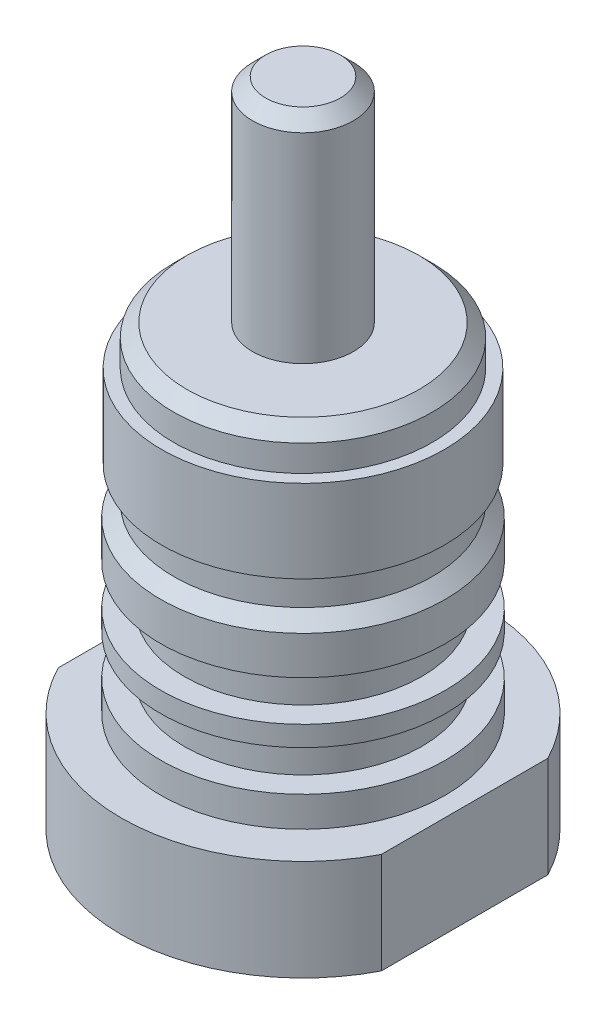
ISO-10303-21;
HEADER;
FILE_DESCRIPTION(('STEP AP214'),'2;1');
FILE_NAME('part.step','',(''),(''),'','','');
FILE_SCHEMA(('AUTOMOTIVE_DESIGN { 1 0 10303 214 1 1 1 1 }'));
ENDSEC;
DATA;
#1=APPLICATION_CONTEXT('core data for automotive mechanical design processes');
#2=APPLICATION_PROTOCOL_DEFINITION('international standard','automotive_design',2000,#1);
#3=PRODUCT_CONTEXT('',#1,'mechanical');
#4=PRODUCT('Part','Part','',(#3));
#5=PRODUCT_RELATED_PRODUCT_CATEGORY('part','',(#4));
#6=PRODUCT_DEFINITION_FORMATION('','',#4);
#7=PRODUCT_DEFINITION_CONTEXT('part definition',#1,'design');
#8=PRODUCT_DEFINITION('design','',#6,#7);
#9=PRODUCT_DEFINITION_SHAPE('','',#8);
#10=(LENGTH_UNIT() NAMED_UNIT(*) SI_UNIT(.MILLI.,.METRE.));
#11=(NAMED_UNIT(*) PLANE_ANGLE_UNIT() SI_UNIT($,.RADIAN.));
#12=(NAMED_UNIT(*) SI_UNIT($,.STERADIAN.) SOLID_ANGLE_UNIT());
#13=UNCERTAINTY_MEASURE_WITH_UNIT(LENGTH_MEASURE(1.E-05),#10,'distance_accuracy_value','');
#14=(GEOMETRIC_REPRESENTATION_CONTEXT(3) GLOBAL_UNCERTAINTY_ASSIGNED_CONTEXT((#13)) GLOBAL_UNIT_ASSIGNED_CONTEXT((#10,
#11,#12)) REPRESENTATION_CONTEXT('',''));
#15=CARTESIAN_POINT('',(0.,0.,0.));
#16=DIRECTION('',(0.,0.,1.));
#17=DIRECTION('',(1.,0.,0.));
#18=AXIS2_PLACEMENT_3D('',#15,#16,#17);
#19=CARTESIAN_POINT('',(0.,0.,0.));
#20=DIRECTION('',(0.,1.,0.));
#21=DIRECTION('',(-1.,0.,0.));
#22=AXIS2_PLACEMENT_3D('',#19,#20,#21);
#23=CYLINDRICAL_SURFACE('',#22,9.);
#24=DIRECTION('',(0.,-1.,0.));
#25=VECTOR('',#24,1.);
#26=CARTESIAN_POINT('',(8.,10.55,4.12310562561766));
#27=LINE('',#26,#25);
#28=CARTESIAN_POINT('',(8.00000000000001,-16.75,4.12310562561766));
#29=VERTEX_POINT('',#28);
#30=CARTESIAN_POINT('',(8.00000000000001,-21.75,4.12310562561766));
#31=VERTEX_POINT('',#30);
#32=EDGE_CURVE('E79',#29,#31,#27,.T.);
#33=ORIENTED_EDGE('',*,*,#32,.F.);
#34=CARTESIAN_POINT('',(0.,-16.75,0.));
#35=DIRECTION('',(0.,1.,0.));
#36=DIRECTION('',(-1.,0.,0.));
#37=AXIS2_PLACEMENT_3D('',#34,#35,#36);
#38=CIRCLE('',#37,9.);
#39=CARTESIAN_POINT('',(-8.,-16.75,4.12310562561765));
#40=VERTEX_POINT('',#39);
#41=EDGE_CURVE('E102',#40,#29,#38,.T.);
#42=ORIENTED_EDGE('',*,*,#41,.F.);
#43=DIRECTION('',(0.,-1.,0.));
#44=VECTOR('',#43,1.);
#45=CARTESIAN_POINT('',(-8.,10.55,4.12310562561766));
#46=LINE('',#45,#44);
#47=CARTESIAN_POINT('',(-8.,-21.75,4.12310562561766));
#48=VERTEX_POINT('',#47);
#49=EDGE_CURVE('E63',#40,#48,#46,.T.);
#50=ORIENTED_EDGE('',*,*,#49,.T.);
#51=CARTESIAN_POINT('',(0.,-21.75,0.));
#52=DIRECTION('',(0.,1.,0.));
#53=DIRECTION('',(-1.,0.,0.));
#54=AXIS2_PLACEMENT_3D('',#51,#52,#53);
#55=CIRCLE('',#54,9.);
#56=EDGE_CURVE('E94',#48,#31,#55,.T.);
#57=ORIENTED_EDGE('',*,*,#56,.T.);
#58=EDGE_LOOP('',(#33,#42,#50,#57));
#59=FACE_BOUND('',#58,.T.);
#60=ADVANCED_FACE('F39',(#59),#23,.T.);
#61=CARTESIAN_POINT('',(0.,-21.75,0.));
#62=DIRECTION('',(0.,-1.,0.));
#63=DIRECTION('',(1.,0.,0.));
#64=AXIS2_PLACEMENT_3D('',#61,#62,#63);
#65=PLANE('',#64);
#66=DIRECTION('',(0.,0.,-1.));
#67=VECTOR('',#66,1.);
#68=CARTESIAN_POINT('',(8.00000000000001,-21.75,4.12310562561766));
#69=LINE('',#68,#67);
#70=CARTESIAN_POINT('',(8.00000000000001,-21.75,-4.12310562561766));
#71=VERTEX_POINT('',#70);
#72=EDGE_CURVE('E82',#31,#71,#69,.T.);
#73=ORIENTED_EDGE('',*,*,#72,.F.);
#74=ORIENTED_EDGE('',*,*,#56,.F.);
#75=DIRECTION('',(0.,0.,1.));
#76=VECTOR('',#75,1.);
#77=CARTESIAN_POINT('',(-8.,-21.75,4.12310562561766));
#78=LINE('',#77,#76);
#79=CARTESIAN_POINT('',(-8.,-21.75,-4.12310562561766));
#80=VERTEX_POINT('',#79);
#81=EDGE_CURVE('E97',#80,#48,#78,.T.);
#82=ORIENTED_EDGE('',*,*,#81,.F.);
#83=EDGE_CURVE('E96',#71,#80,#55,.T.);
#84=ORIENTED_EDGE('',*,*,#83,.F.);
#85=EDGE_LOOP('',(#73,#74,#82,#84));
#86=FACE_BOUND('',#85,.T.);
#87=ADVANCED_FACE('F92',(#86),#65,.T.);
#88=DIRECTION('',(0.,-1.,0.));
#89=VECTOR('',#88,1.);
#90=CARTESIAN_POINT('',(8.,10.55,-4.12310562561766));
#91=LINE('',#90,#89);
#92=CARTESIAN_POINT('',(8.,-16.75,-4.12310562561765));
#93=VERTEX_POINT('',#92);
#94=EDGE_CURVE('E55',#93,#71,#91,.T.);
#95=ORIENTED_EDGE('',*,*,#94,.T.);
#96=ORIENTED_EDGE('',*,*,#83,.T.);
#97=DIRECTION('',(0.,-1.,0.));
#98=VECTOR('',#97,1.);
#99=CARTESIAN_POINT('',(-8.,10.55,-4.12310562561766));
#100=LINE('',#99,#98);
#101=CARTESIAN_POINT('',(-8.,-16.75,-4.12310562561766));
#102=VERTEX_POINT('',#101);
#103=EDGE_CURVE('E155',#102,#80,#100,.T.);
#104=ORIENTED_EDGE('',*,*,#103,.F.);
#105=EDGE_CURVE('E148',#93,#102,#38,.T.);
#106=ORIENTED_EDGE('',*,*,#105,.F.);
#107=EDGE_LOOP('',(#95,#96,#104,#106));
#108=FACE_BOUND('',#107,.T.);
#109=ADVANCED_FACE('F131',(#108),#23,.T.);
#110=CARTESIAN_POINT('',(-8.99999999999999,-16.75,0.));
#111=DIRECTION('',(0.,1.,0.));
#112=DIRECTION('',(-1.,0.,0.));
#113=AXIS2_PLACEMENT_3D('',#110,#111,#112);
#114=PLANE('',#113);
#115=DIRECTION('',(0.,0.,1.));
#116=VECTOR('',#115,1.);
#117=CARTESIAN_POINT('',(8.,-16.75,0.));
#118=LINE('',#117,#116);
#119=EDGE_CURVE('E83',#93,#29,#118,.T.);
#120=ORIENTED_EDGE('',*,*,#119,.F.);
#121=ORIENTED_EDGE('',*,*,#105,.T.);
#122=DIRECTION('',(0.,0.,-1.));
#123=VECTOR('',#122,1.);
#124=CARTESIAN_POINT('',(-8.,-16.75,0.));
#125=LINE('',#124,#123);
#126=EDGE_CURVE('E99',#40,#102,#125,.T.);
#127=ORIENTED_EDGE('',*,*,#126,.F.);
#128=ORIENTED_EDGE('',*,*,#41,.T.);
#129=EDGE_LOOP('',(#120,#121,#127,#128));
#130=FACE_BOUND('',#129,.T.);
#131=CARTESIAN_POINT('',(0.,-16.75,0.));
#132=DIRECTION('',(0.,1.,0.));
#133=DIRECTION('',(-1.,0.,0.));
#134=AXIS2_PLACEMENT_3D('',#131,#132,#133);
#135=CIRCLE('',#134,7.05);
#136=CARTESIAN_POINT('',(-7.05,-16.75,0.));
#137=VERTEX_POINT('',#136);
#138=EDGE_CURVE('E196',#137,#137,#135,.T.);
#139=ORIENTED_EDGE('',*,*,#138,.F.);
#140=EDGE_LOOP('',(#139));
#141=FACE_BOUND('',#140,.T.);
#142=ADVANCED_FACE('F138',(#130,#141),#114,.T.);
#143=CARTESIAN_POINT('',(0.,0.,0.));
#144=DIRECTION('',(0.,1.,0.));
#145=DIRECTION('',(-1.,0.,0.));
#146=AXIS2_PLACEMENT_3D('',#143,#144,#145);
#147=CYLINDRICAL_SURFACE('',#146,7.05);
#148=ORIENTED_EDGE('',*,*,#138,.T.);
#149=EDGE_LOOP('',(#148));
#150=FACE_BOUND('',#149,.T.);
#151=CARTESIAN_POINT('',(0.,-15.25,0.));
#152=DIRECTION('',(0.,1.,0.));
#153=DIRECTION('',(-1.,0.,0.));
#154=AXIS2_PLACEMENT_3D('',#151,#152,#153);
#155=CIRCLE('',#154,7.05);
#156=CARTESIAN_POINT('',(-7.05,-15.25,0.));
#157=VERTEX_POINT('',#156);
#158=EDGE_CURVE('E194',#157,#157,#155,.T.);
#159=ORIENTED_EDGE('',*,*,#158,.F.);
#160=EDGE_LOOP('',(#159));
#161=FACE_BOUND('',#160,.T.);
#162=ADVANCED_FACE('F143',(#150,#161),#147,.T.);
#163=CARTESIAN_POINT('',(-7.05,-15.25,0.));
#164=DIRECTION('',(0.,1.,0.));
#165=DIRECTION('',(-1.,0.,0.));
#166=AXIS2_PLACEMENT_3D('',#163,#164,#165);
#167=PLANE('',#166);
#168=ORIENTED_EDGE('',*,*,#158,.T.);
#169=EDGE_LOOP('',(#168));
#170=FACE_BOUND('',#169,.T.);
#171=CARTESIAN_POINT('',(0.,-15.25,0.));
#172=DIRECTION('',(0.,1.,0.));
#173=DIRECTION('',(-1.,0.,0.));
#174=AXIS2_PLACEMENT_3D('',#171,#172,#173);
#175=CIRCLE('',#174,5.875);
#176=CARTESIAN_POINT('',(-5.875,-15.25,0.));
#177=VERTEX_POINT('',#176);
#178=EDGE_CURVE('E191',#177,#177,#175,.T.);
#179=ORIENTED_EDGE('',*,*,#178,.F.);
#180=EDGE_LOOP('',(#179));
#181=FACE_BOUND('',#180,.T.);
#182=ADVANCED_FACE('F266',(#170,#181),#167,.T.);
#183=CARTESIAN_POINT('',(0.,0.,0.));
#184=DIRECTION('',(0.,1.,0.));
#185=DIRECTION('',(-1.,0.,0.));
#186=AXIS2_PLACEMENT_3D('',#183,#184,#185);
#187=CYLINDRICAL_SURFACE('',#186,5.875);
#188=ORIENTED_EDGE('',*,*,#178,.T.);
#189=EDGE_LOOP('',(#188));
#190=FACE_BOUND('',#189,.T.);
#191=CARTESIAN_POINT('',(0.,-13.25,0.));
#192=DIRECTION('',(0.,1.,0.));
#193=DIRECTION('',(-1.,0.,0.));
#194=AXIS2_PLACEMENT_3D('',#191,#192,#193);
#195=CIRCLE('',#194,5.875);
#196=CARTESIAN_POINT('',(-5.875,-13.25,0.));
#197=VERTEX_POINT('',#196);
#198=EDGE_CURVE('E188',#197,#197,#195,.T.);
#199=ORIENTED_EDGE('',*,*,#198,.F.);
#200=EDGE_LOOP('',(#199));
#201=FACE_BOUND('',#200,.T.);
#202=ADVANCED_FACE('F262',(#190,#201),#187,.T.);
#203=CARTESIAN_POINT('',(-5.875,-13.25,0.));
#204=DIRECTION('',(0.,-1.,0.));
#205=DIRECTION('',(1.,0.,0.));
#206=AXIS2_PLACEMENT_3D('',#203,#204,#205);
#207=PLANE('',#206);
#208=ORIENTED_EDGE('',*,*,#198,.T.);
#209=EDGE_LOOP('',(#208));
#210=FACE_BOUND('',#209,.T.);
#211=CARTESIAN_POINT('',(0.,-13.25,0.));
#212=DIRECTION('',(0.,1.,0.));
#213=DIRECTION('',(-1.,0.,0.));
#214=AXIS2_PLACEMENT_3D('',#211,#212,#213);
#215=CIRCLE('',#214,7.05);
#216=CARTESIAN_POINT('',(-7.05,-13.25,0.));
#217=VERTEX_POINT('',#216);
#218=EDGE_CURVE('E185',#217,#217,#215,.T.);
#219=ORIENTED_EDGE('',*,*,#218,.F.);
#220=EDGE_LOOP('',(#219));
#221=FACE_BOUND('',#220,.T.);
#222=ADVANCED_FACE('F258',(#210,#221),#207,.T.);
#223=CARTESIAN_POINT('',(0.,0.,0.));
#224=DIRECTION('',(0.,1.,0.));
#225=DIRECTION('',(-1.,0.,0.));
#226=AXIS2_PLACEMENT_3D('',#223,#224,#225);
#227=CYLINDRICAL_SURFACE('',#226,7.05);
#228=ORIENTED_EDGE('',*,*,#218,.T.);
#229=EDGE_LOOP('',(#228));
#230=FACE_BOUND('',#229,.T.);
#231=CARTESIAN_POINT('',(0.,-12.25,0.));
#232=DIRECTION('',(0.,1.,0.));
#233=DIRECTION('',(-1.,0.,0.));
#234=AXIS2_PLACEMENT_3D('',#231,#232,#233);
#235=CIRCLE('',#234,7.05);
#236=CARTESIAN_POINT('',(-7.05,-12.25,0.));
#237=VERTEX_POINT('',#236);
#238=EDGE_CURVE('E182',#237,#237,#235,.T.);
#239=ORIENTED_EDGE('',*,*,#238,.F.);
#240=EDGE_LOOP('',(#239));
#241=FACE_BOUND('',#240,.T.);
#242=ADVANCED_FACE('F254',(#230,#241),#227,.T.);
#243=CARTESIAN_POINT('',(-7.05,-12.25,0.));
#244=DIRECTION('',(0.,1.,0.));
#245=DIRECTION('',(-1.,0.,0.));
#246=AXIS2_PLACEMENT_3D('',#243,#244,#245);
#247=PLANE('',#246);
#248=ORIENTED_EDGE('',*,*,#238,.T.);
#249=EDGE_LOOP('',(#248));
#250=FACE_BOUND('',#249,.T.);
#251=CARTESIAN_POINT('',(0.,-12.25,0.));
#252=DIRECTION('',(0.,1.,0.));
#253=DIRECTION('',(-1.,0.,0.));
#254=AXIS2_PLACEMENT_3D('',#251,#252,#253);
#255=CIRCLE('',#254,5.875);
#256=CARTESIAN_POINT('',(-5.875,-12.25,0.));
#257=VERTEX_POINT('',#256);
#258=EDGE_CURVE('E179',#257,#257,#255,.T.);
#259=ORIENTED_EDGE('',*,*,#258,.F.);
#260=EDGE_LOOP('',(#259));
#261=FACE_BOUND('',#260,.T.);
#262=ADVANCED_FACE('F250',(#250,#261),#247,.T.);
#263=CARTESIAN_POINT('',(0.,0.,0.));
#264=DIRECTION('',(0.,1.,0.));
#265=DIRECTION('',(-1.,0.,0.));
#266=AXIS2_PLACEMENT_3D('',#263,#264,#265);
#267=CYLINDRICAL_SURFACE('',#266,5.875);
#268=ORIENTED_EDGE('',*,*,#258,.T.);
#269=EDGE_LOOP('',(#268));
#270=FACE_BOUND('',#269,.T.);
#271=CARTESIAN_POINT('',(0.,-10.25,0.));
#272=DIRECTION('',(0.,1.,0.));
#273=DIRECTION('',(-1.,0.,0.));
#274=AXIS2_PLACEMENT_3D('',#271,#272,#273);
#275=CIRCLE('',#274,5.875);
#276=CARTESIAN_POINT('',(-5.875,-10.25,0.));
#277=VERTEX_POINT('',#276);
#278=EDGE_CURVE('E176',#277,#277,#275,.T.);
#279=ORIENTED_EDGE('',*,*,#278,.F.);
#280=EDGE_LOOP('',(#279));
#281=FACE_BOUND('',#280,.T.);
#282=ADVANCED_FACE('F246',(#270,#281),#267,.T.);
#283=CARTESIAN_POINT('',(-5.875,-10.25,0.));
#284=DIRECTION('',(0.,-1.,0.));
#285=DIRECTION('',(1.,0.,0.));
#286=AXIS2_PLACEMENT_3D('',#283,#284,#285);
#287=PLANE('',#286);
#288=ORIENTED_EDGE('',*,*,#278,.T.);
#289=EDGE_LOOP('',(#288));
#290=FACE_BOUND('',#289,.T.);
#291=CARTESIAN_POINT('',(0.,-10.25,0.));
#292=DIRECTION('',(0.,1.,0.));
#293=DIRECTION('',(-1.,0.,0.));
#294=AXIS2_PLACEMENT_3D('',#291,#292,#293);
#295=CIRCLE('',#294,7.05);
#296=CARTESIAN_POINT('',(-7.05,-10.25,0.));
#297=VERTEX_POINT('',#296);
#298=EDGE_CURVE('E173',#297,#297,#295,.T.);
#299=ORIENTED_EDGE('',*,*,#298,.F.);
#300=EDGE_LOOP('',(#299));
#301=FACE_BOUND('',#300,.T.);
#302=ADVANCED_FACE('F242',(#290,#301),#287,.T.);
#303=CARTESIAN_POINT('',(0.,0.,0.));
#304=DIRECTION('',(0.,1.,0.));
#305=DIRECTION('',(-1.,0.,0.));
#306=AXIS2_PLACEMENT_3D('',#303,#304,#305);
#307=CYLINDRICAL_SURFACE('',#306,7.05);
#308=CARTESIAN_POINT('',(0.,-8.35,0.));
#309=DIRECTION('',(0.,1.,0.));
#310=DIRECTION('',(-1.,0.,0.));
#311=AXIS2_PLACEMENT_3D('',#308,#309,#310);
#312=CIRCLE('',#311,7.05);
#313=CARTESIAN_POINT('',(-7.05,-8.35,0.));
#314=VERTEX_POINT('',#313);
#315=EDGE_CURVE('E107',#314,#314,#312,.F.);
#316=ORIENTED_EDGE('',*,*,#315,.T.);
#317=EDGE_LOOP('',(#316));
#318=FACE_BOUND('',#317,.T.);
#319=ORIENTED_EDGE('',*,*,#298,.T.);
#320=EDGE_LOOP('',(#319));
#321=FACE_BOUND('',#320,.T.);
#322=ADVANCED_FACE('F238',(#318,#321),#307,.T.);
#323=CARTESIAN_POINT('',(0.,0.,0.));
#324=DIRECTION('',(0.,1.,0.));
#325=DIRECTION('',(-1.,0.,0.));
#326=AXIS2_PLACEMENT_3D('',#323,#324,#325);
#327=CYLINDRICAL_SURFACE('',#326,6.4);
#328=CARTESIAN_POINT('',(0.,-7.7,0.));
#329=DIRECTION('',(0.,1.,0.));
#330=DIRECTION('',(-1.,0.,0.));
#331=AXIS2_PLACEMENT_3D('',#328,#329,#330);
#332=CIRCLE('',#331,6.4);
#333=CARTESIAN_POINT('',(-6.4,-7.7,0.));
#334=VERTEX_POINT('',#333);
#335=EDGE_CURVE('E170',#334,#334,#332,.T.);
#336=ORIENTED_EDGE('',*,*,#335,.T.);
#337=EDGE_LOOP('',(#336));
#338=FACE_BOUND('',#337,.T.);
#339=CARTESIAN_POINT('',(0.,-6.05,0.));
#340=DIRECTION('',(0.,1.,0.));
#341=DIRECTION('',(-1.,0.,0.));
#342=AXIS2_PLACEMENT_3D('',#339,#340,#341);
#343=CIRCLE('',#342,6.4);
#344=CARTESIAN_POINT('',(-6.4,-6.05,0.));
#345=VERTEX_POINT('',#344);
#346=EDGE_CURVE('E167',#345,#345,#343,.T.);
#347=ORIENTED_EDGE('',*,*,#346,.F.);
#348=EDGE_LOOP('',(#347));
#349=FACE_BOUND('',#348,.T.);
#350=ADVANCED_FACE('F234',(#338,#349),#327,.T.);
#351=CARTESIAN_POINT('',(-6.4,-6.05,0.));
#352=DIRECTION('',(0.,-1.,0.));
#353=DIRECTION('',(1.,0.,0.));
#354=AXIS2_PLACEMENT_3D('',#351,#352,#353);
#355=PLANE('',#354);
#356=ORIENTED_EDGE('',*,*,#346,.T.);
#357=EDGE_LOOP('',(#356));
#358=FACE_BOUND('',#357,.T.);
#359=CARTESIAN_POINT('',(0.,-6.05,0.));
#360=DIRECTION('',(0.,1.,0.));
#361=DIRECTION('',(-1.,0.,0.));
#362=AXIS2_PLACEMENT_3D('',#359,#360,#361);
#363=CIRCLE('',#362,7.);
#364=CARTESIAN_POINT('',(-7.,-6.05,0.));
#365=VERTEX_POINT('',#364);
#366=EDGE_CURVE('E164',#365,#365,#363,.T.);
#367=ORIENTED_EDGE('',*,*,#366,.F.);
#368=EDGE_LOOP('',(#367));
#369=FACE_BOUND('',#368,.T.);
#370=ADVANCED_FACE('F230',(#358,#369),#355,.T.);
#371=CARTESIAN_POINT('',(0.,0.,0.));
#372=DIRECTION('',(0.,1.,0.));
#373=DIRECTION('',(-1.,0.,0.));
#374=AXIS2_PLACEMENT_3D('',#371,#372,#373);
#375=CYLINDRICAL_SURFACE('',#374,7.);
#376=ORIENTED_EDGE('',*,*,#366,.T.);
#377=EDGE_LOOP('',(#376));
#378=FACE_BOUND('',#377,.T.);
#379=CARTESIAN_POINT('',(0.,-1.95,0.));
#380=DIRECTION('',(0.,1.,0.));
#381=DIRECTION('',(-1.,0.,0.));
#382=AXIS2_PLACEMENT_3D('',#379,#380,#381);
#383=CIRCLE('',#382,7.);
#384=CARTESIAN_POINT('',(-7.,-1.95,0.));
#385=VERTEX_POINT('',#384);
#386=EDGE_CURVE('E161',#385,#385,#383,.T.);
#387=ORIENTED_EDGE('',*,*,#386,.F.);
#388=EDGE_LOOP('',(#387));
#389=FACE_BOUND('',#388,.T.);
#390=ADVANCED_FACE('F226',(#378,#389),#375,.T.);
#391=CARTESIAN_POINT('',(-7.,-1.95,0.));
#392=DIRECTION('',(0.,1.,0.));
#393=DIRECTION('',(-1.,0.,0.));
#394=AXIS2_PLACEMENT_3D('',#391,#392,#393);
#395=PLANE('',#394);
#396=ORIENTED_EDGE('',*,*,#386,.T.);
#397=EDGE_LOOP('',(#396));
#398=FACE_BOUND('',#397,.T.);
#399=CARTESIAN_POINT('',(0.,-1.95,0.));
#400=DIRECTION('',(0.,1.,0.));
#401=DIRECTION('',(-1.,0.,0.));
#402=AXIS2_PLACEMENT_3D('',#399,#400,#401);
#403=CIRCLE('',#402,6.4);
#404=CARTESIAN_POINT('',(-6.4,-1.95,0.));
#405=VERTEX_POINT('',#404);
#406=EDGE_CURVE('E152',#405,#405,#403,.T.);
#407=ORIENTED_EDGE('',*,*,#406,.F.);
#408=EDGE_LOOP('',(#407));
#409=FACE_BOUND('',#408,.T.);
#410=ADVANCED_FACE('F222',(#398,#409),#395,.T.);
#411=CARTESIAN_POINT('',(0.,0.,0.));
#412=DIRECTION('',(0.,1.,0.));
#413=DIRECTION('',(-1.,0.,0.));
#414=AXIS2_PLACEMENT_3D('',#411,#412,#413);
#415=CYLINDRICAL_SURFACE('',#414,6.4);
#416=CARTESIAN_POINT('',(0.,-0.649999999999999,0.));
#417=DIRECTION('',(0.,1.,0.));
#418=DIRECTION('',(-1.,0.,0.));
#419=AXIS2_PLACEMENT_3D('',#416,#417,#418);
#420=CIRCLE('',#419,6.4);
#421=CARTESIAN_POINT('',(-6.4,-0.65,0.));
#422=VERTEX_POINT('',#421);
#423=EDGE_CURVE('E113',#422,#422,#420,.F.);
#424=ORIENTED_EDGE('',*,*,#423,.T.);
#425=EDGE_LOOP('',(#424));
#426=FACE_BOUND('',#425,.T.);
#427=ORIENTED_EDGE('',*,*,#406,.T.);
#428=EDGE_LOOP('',(#427));
#429=FACE_BOUND('',#428,.T.);
#430=ADVANCED_FACE('F218',(#426,#429),#415,.T.);
#431=CARTESIAN_POINT('',(-6.4,0.,0.));
#432=DIRECTION('',(0.,1.,0.));
#433=DIRECTION('',(-1.,0.,0.));
#434=AXIS2_PLACEMENT_3D('',#431,#432,#433);
#435=PLANE('',#434);
#436=CARTESIAN_POINT('',(0.,0.,0.));
#437=DIRECTION('',(0.,1.,0.));
#438=DIRECTION('',(-1.,0.,0.));
#439=AXIS2_PLACEMENT_3D('',#436,#437,#438);
#440=CIRCLE('',#439,5.75);
#441=CARTESIAN_POINT('',(-5.75,0.,0.));
#442=VERTEX_POINT('',#441);
#443=EDGE_CURVE('E110',#442,#442,#440,.T.);
#444=ORIENTED_EDGE('',*,*,#443,.T.);
#445=EDGE_LOOP('',(#444));
#446=FACE_BOUND('',#445,.T.);
#447=CARTESIAN_POINT('',(0.,0.,0.));
#448=DIRECTION('',(0.,1.,0.));
#449=DIRECTION('',(-1.,0.,0.));
#450=AXIS2_PLACEMENT_3D('',#447,#448,#449);
#451=CIRCLE('',#450,2.5);
#452=CARTESIAN_POINT('',(-2.5,0.,0.));
#453=VERTEX_POINT('',#452);
#454=EDGE_CURVE('E149',#453,#453,#451,.T.);
#455=ORIENTED_EDGE('',*,*,#454,.F.);
#456=EDGE_LOOP('',(#455));
#457=FACE_BOUND('',#456,.T.);
#458=ADVANCED_FACE('F214',(#446,#457),#435,.T.);
#459=CARTESIAN_POINT('',(0.,0.,0.));
#460=DIRECTION('',(0.,1.,0.));
#461=DIRECTION('',(-1.,0.,0.));
#462=AXIS2_PLACEMENT_3D('',#459,#460,#461);
#463=CYLINDRICAL_SURFACE('',#462,2.5);
#464=CARTESIAN_POINT('',(0.,9.90000000000001,0.));
#465=DIRECTION('',(0.,1.,0.));
#466=DIRECTION('',(-1.,0.,0.));
#467=AXIS2_PLACEMENT_3D('',#464,#465,#466);
#468=CIRCLE('',#467,2.5);
#469=CARTESIAN_POINT('',(-2.5,9.90000000000001,0.));
#470=VERTEX_POINT('',#469);
#471=EDGE_CURVE('E11',#470,#470,#468,.F.);
#472=ORIENTED_EDGE('',*,*,#471,.T.);
#473=EDGE_LOOP('',(#472));
#474=FACE_BOUND('',#473,.T.);
#475=ORIENTED_EDGE('',*,*,#454,.T.);
#476=EDGE_LOOP('',(#475));
#477=FACE_BOUND('',#476,.T.);
#478=ADVANCED_FACE('F209',(#474,#477),#463,.T.);
#479=CARTESIAN_POINT('',(-2.5,10.55,0.));
#480=DIRECTION('',(0.,1.,0.));
#481=DIRECTION('',(-1.,0.,0.));
#482=AXIS2_PLACEMENT_3D('',#479,#480,#481);
#483=PLANE('',#482);
#484=CARTESIAN_POINT('',(0.,10.55,0.));
#485=DIRECTION('',(0.,1.,0.));
#486=DIRECTION('',(-1.,0.,0.));
#487=AXIS2_PLACEMENT_3D('',#484,#485,#486);
#488=CIRCLE('',#487,1.85000000000001);
#489=CARTESIAN_POINT('',(-1.85000000000001,10.55,0.));
#490=VERTEX_POINT('',#489);
#491=EDGE_CURVE('E48',#490,#490,#488,.T.);
#492=ORIENTED_EDGE('',*,*,#491,.T.);
#493=EDGE_LOOP('',(#492));
#494=FACE_BOUND('',#493,.T.);
#495=ADVANCED_FACE('F118',(#494),#483,.T.);
#496=CARTESIAN_POINT('',(-8.,10.55,4.12310562561766));
#497=DIRECTION('',(1.,0.,0.));
#498=DIRECTION('',(0.,1.,0.));
#499=AXIS2_PLACEMENT_3D('',#496,#497,#498);
#500=PLANE('',#499);
#501=ORIENTED_EDGE('',*,*,#126,.T.);
#502=ORIENTED_EDGE('',*,*,#103,.T.);
#503=ORIENTED_EDGE('',*,*,#81,.T.);
#504=ORIENTED_EDGE('',*,*,#49,.F.);
#505=EDGE_LOOP('',(#501,#502,#503,#504));
#506=FACE_BOUND('',#505,.T.);
#507=ADVANCED_FACE('F201',(#506),#500,.F.);
#508=CARTESIAN_POINT('',(8.,10.55,4.12310562561766));
#509=DIRECTION('',(-1.,0.,0.));
#510=DIRECTION('',(0.,-1.,0.));
#511=AXIS2_PLACEMENT_3D('',#508,#509,#510);
#512=PLANE('',#511);
#513=ORIENTED_EDGE('',*,*,#119,.T.);
#514=ORIENTED_EDGE('',*,*,#32,.T.);
#515=ORIENTED_EDGE('',*,*,#72,.T.);
#516=ORIENTED_EDGE('',*,*,#94,.F.);
#517=EDGE_LOOP('',(#513,#514,#515,#516));
#518=FACE_BOUND('',#517,.T.);
#519=ADVANCED_FACE('F81',(#518),#512,.F.);
#520=CARTESIAN_POINT('',(0.,-7.7,0.));
#521=DIRECTION('',(0.,-1.,0.));
#522=DIRECTION('',(1.,0.,0.));
#523=AXIS2_PLACEMENT_3D('',#520,#521,#522);
#524=CONICAL_SURFACE('',#523,6.40000000000001,0.785398163397443);
#525=ORIENTED_EDGE('',*,*,#315,.F.);
#526=EDGE_LOOP('',(#525));
#527=FACE_BOUND('',#526,.T.);
#528=ORIENTED_EDGE('',*,*,#335,.F.);
#529=EDGE_LOOP('',(#528));
#530=FACE_BOUND('',#529,.T.);
#531=ADVANCED_FACE('F126',(#527,#530),#524,.T.);
#532=CARTESIAN_POINT('',(0.,0.,0.));
#533=DIRECTION('',(0.,-1.,0.));
#534=DIRECTION('',(1.,0.,0.));
#535=AXIS2_PLACEMENT_3D('',#532,#533,#534);
#536=CONICAL_SURFACE('',#535,5.75,0.785398163397446);
#537=ORIENTED_EDGE('',*,*,#423,.F.);
#538=EDGE_LOOP('',(#537));
#539=FACE_BOUND('',#538,.T.);
#540=ORIENTED_EDGE('',*,*,#443,.F.);
#541=EDGE_LOOP('',(#540));
#542=FACE_BOUND('',#541,.T.);
#543=ADVANCED_FACE('F121',(#539,#542),#536,.T.);
#544=CARTESIAN_POINT('',(0.,10.55,0.));
#545=DIRECTION('',(0.,-1.,0.));
#546=DIRECTION('',(1.,0.,0.));
#547=AXIS2_PLACEMENT_3D('',#544,#545,#546);
#548=CONICAL_SURFACE('',#547,1.85000000000001,0.785398163397448);
#549=ORIENTED_EDGE('',*,*,#471,.F.);
#550=EDGE_LOOP('',(#549));
#551=FACE_BOUND('',#550,.T.);
#552=ORIENTED_EDGE('',*,*,#491,.F.);
#553=EDGE_LOOP('',(#552));
#554=FACE_BOUND('',#553,.T.);
#555=ADVANCED_FACE('F42',(#551,#554),#548,.T.);
#556=CLOSED_SHELL('',(#60,#87,#109,#142,#162,#182,#202,#222,#242,#262,#282,#302,#322,#350,#370,
#390,#410,#430,#458,#478,#495,#507,#519,#531,#543,#555));
#557=MANIFOLD_SOLID_BREP('B2',#556);
#558=ADVANCED_BREP_SHAPE_REPRESENTATION('',(#18,#557),#14);
#559=SHAPE_DEFINITION_REPRESENTATION(#9,#558);
ENDSEC;
END-ISO-10303-21;
